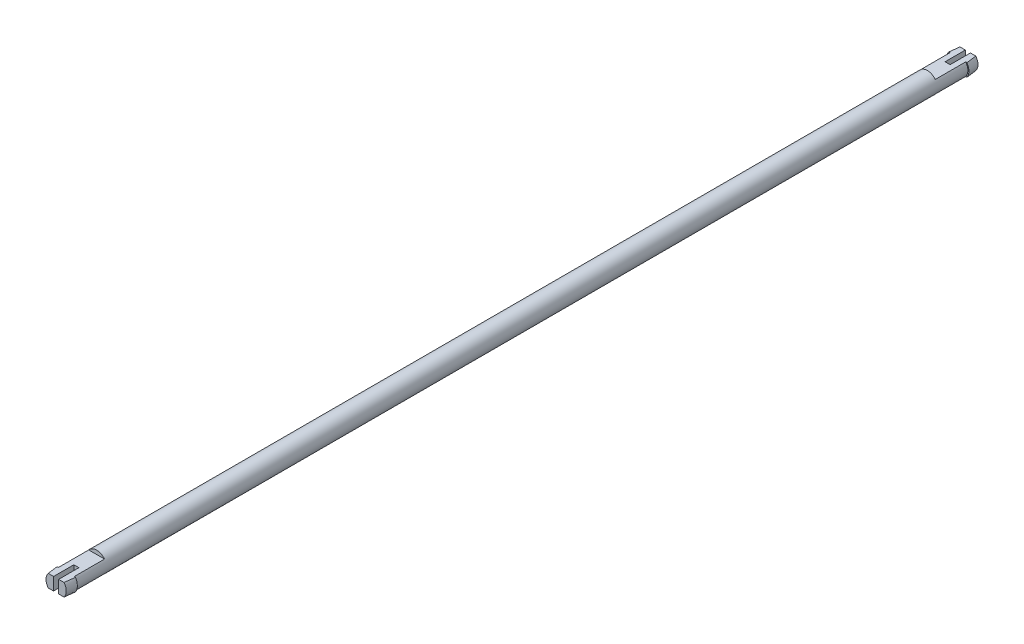
ISO-10303-21;
HEADER;
FILE_DESCRIPTION(('STEP AP214'),'2;1');
FILE_NAME('part.step','',(''),(''),'','','');
FILE_SCHEMA(('AUTOMOTIVE_DESIGN { 1 0 10303 214 1 1 1 1 }'));
ENDSEC;
DATA;
#1=APPLICATION_CONTEXT('core data for automotive mechanical design processes');
#2=APPLICATION_PROTOCOL_DEFINITION('international standard','automotive_design',2000,#1);
#3=PRODUCT_CONTEXT('',#1,'mechanical');
#4=PRODUCT('Part','Part','',(#3));
#5=PRODUCT_RELATED_PRODUCT_CATEGORY('part','',(#4));
#6=PRODUCT_DEFINITION_FORMATION('','',#4);
#7=PRODUCT_DEFINITION_CONTEXT('part definition',#1,'design');
#8=PRODUCT_DEFINITION('design','',#6,#7);
#9=PRODUCT_DEFINITION_SHAPE('','',#8);
#10=(LENGTH_UNIT() NAMED_UNIT(*) SI_UNIT(.MILLI.,.METRE.));
#11=(NAMED_UNIT(*) PLANE_ANGLE_UNIT() SI_UNIT($,.RADIAN.));
#12=(NAMED_UNIT(*) SI_UNIT($,.STERADIAN.) SOLID_ANGLE_UNIT());
#13=UNCERTAINTY_MEASURE_WITH_UNIT(LENGTH_MEASURE(1.E-05),#10,'distance_accuracy_value','');
#14=(GEOMETRIC_REPRESENTATION_CONTEXT(3) GLOBAL_UNCERTAINTY_ASSIGNED_CONTEXT((#13)) GLOBAL_UNIT_ASSIGNED_CONTEXT((#10,
#11,#12)) REPRESENTATION_CONTEXT('',''));
#15=CARTESIAN_POINT('',(0.,0.,0.));
#16=DIRECTION('',(0.,0.,1.));
#17=DIRECTION('',(1.,0.,0.));
#18=AXIS2_PLACEMENT_3D('',#15,#16,#17);
#19=CARTESIAN_POINT('',(0.,0.,-180.));
#20=DIRECTION('',(0.,0.,1.));
#21=DIRECTION('',(1.,0.,0.));
#22=AXIS2_PLACEMENT_3D('',#19,#20,#21);
#23=PLANE('',#22);
#24=DIRECTION('',(-1.,0.,0.));
#25=VECTOR('',#24,1.);
#26=CARTESIAN_POINT('',(0.,-1.25,-180.));
#27=LINE('',#26,#25);
#28=CARTESIAN_POINT('',(1.5612494995996,-1.25,-180.));
#29=VERTEX_POINT('',#28);
#30=CARTESIAN_POINT('',(0.49999999999999,-1.25,-180.));
#31=VERTEX_POINT('',#30);
#32=EDGE_CURVE('E215',#29,#31,#27,.T.);
#33=ORIENTED_EDGE('',*,*,#32,.T.);
#34=DIRECTION('',(0.,1.,0.));
#35=VECTOR('',#34,1.);
#36=CARTESIAN_POINT('',(0.49999999999999,-2.,-180.));
#37=LINE('',#36,#35);
#38=CARTESIAN_POINT('',(0.49999999999999,1.25,-180.));
#39=VERTEX_POINT('',#38);
#40=EDGE_CURVE('E201',#31,#39,#37,.T.);
#41=ORIENTED_EDGE('',*,*,#40,.T.);
#42=DIRECTION('',(1.,0.,0.));
#43=VECTOR('',#42,1.);
#44=CARTESIAN_POINT('',(0.,1.25,-180.));
#45=LINE('',#44,#43);
#46=CARTESIAN_POINT('',(1.5612494995996,1.25,-180.));
#47=VERTEX_POINT('',#46);
#48=EDGE_CURVE('E213',#39,#47,#45,.T.);
#49=ORIENTED_EDGE('',*,*,#48,.T.);
#50=CARTESIAN_POINT('',(0.,0.,-180.));
#51=DIRECTION('',(0.,0.,1.));
#52=DIRECTION('',(1.,0.,0.));
#53=AXIS2_PLACEMENT_3D('',#50,#51,#52);
#54=CIRCLE('',#53,2.);
#55=EDGE_CURVE('E410',#29,#47,#54,.T.);
#56=ORIENTED_EDGE('',*,*,#55,.F.);
#57=EDGE_LOOP('',(#33,#41,#49,#56));
#58=FACE_BOUND('',#57,.T.);
#59=ADVANCED_FACE('F36',(#58),#23,.F.);
#60=CARTESIAN_POINT('',(0.,0.,-178.));
#61=DIRECTION('',(0.,0.,1.));
#62=DIRECTION('',(1.,0.,0.));
#63=AXIS2_PLACEMENT_3D('',#60,#61,#62);
#64=PLANE('',#63);
#65=DIRECTION('',(-1.,0.,0.));
#66=VECTOR('',#65,1.);
#67=CARTESIAN_POINT('',(0.,-1.25,-178.));
#68=LINE('',#67,#66);
#69=CARTESIAN_POINT('',(1.81038669902326,-1.25,-178.));
#70=VERTEX_POINT('',#69);
#71=CARTESIAN_POINT('',(1.5612494995996,-1.25,-178.));
#72=VERTEX_POINT('',#71);
#73=EDGE_CURVE('E262',#70,#72,#68,.T.);
#74=ORIENTED_EDGE('',*,*,#73,.F.);
#75=CARTESIAN_POINT('',(0.,0.,-178.));
#76=DIRECTION('',(0.,0.,1.));
#77=DIRECTION('',(1.,0.,0.));
#78=AXIS2_PLACEMENT_3D('',#75,#76,#77);
#79=CIRCLE('',#78,2.2);
#80=CARTESIAN_POINT('',(1.81038669902326,1.25,-178.));
#81=VERTEX_POINT('',#80);
#82=EDGE_CURVE('E309',#70,#81,#79,.T.);
#83=ORIENTED_EDGE('',*,*,#82,.T.);
#84=DIRECTION('',(1.,0.,0.));
#85=VECTOR('',#84,1.);
#86=CARTESIAN_POINT('',(0.,1.25,-178.));
#87=LINE('',#86,#85);
#88=CARTESIAN_POINT('',(1.5612494995996,1.25,-178.));
#89=VERTEX_POINT('',#88);
#90=EDGE_CURVE('E293',#89,#81,#87,.T.);
#91=ORIENTED_EDGE('',*,*,#90,.F.);
#92=CARTESIAN_POINT('',(0.,0.,-178.));
#93=DIRECTION('',(0.,0.,1.));
#94=DIRECTION('',(1.,0.,0.));
#95=AXIS2_PLACEMENT_3D('',#92,#93,#94);
#96=CIRCLE('',#95,2.);
#97=EDGE_CURVE('E225',#89,#72,#96,.F.);
#98=ORIENTED_EDGE('',*,*,#97,.T.);
#99=EDGE_LOOP('',(#74,#83,#91,#98));
#100=FACE_BOUND('',#99,.T.);
#101=ADVANCED_FACE('F451',(#100),#64,.T.);
#102=CARTESIAN_POINT('',(0.,0.,-178.));
#103=DIRECTION('',(0.,0.,1.));
#104=DIRECTION('',(1.,0.,0.));
#105=AXIS2_PLACEMENT_3D('',#102,#103,#104);
#106=CONICAL_SURFACE('',#105,2.2,0.0996686524911558);
#107=CARTESIAN_POINT('',(-2.07154781563106,-1.25,-175.805351103093));
#108=CARTESIAN_POINT('',(-2.03550722726415,-1.25,-176.113918017925));
#109=CARTESIAN_POINT('',(-1.99922295149765,-1.25,-176.422456319055));
#110=CARTESIAN_POINT('',(-1.92607039278535,-1.25,-177.039464824649));
#111=CARTESIAN_POINT('',(-1.88920210764818,-1.25,-177.347935028854));
#112=CARTESIAN_POINT('',(-1.77758091435321,-1.25,-178.273188755434));
#113=CARTESIAN_POINT('',(-1.70180760472736,-1.25,-178.889850372761));
#114=CARTESIAN_POINT('',(-1.58512147260781,-1.25,-179.814476021835));
#115=CARTESIAN_POINT('',(-1.54572075887386,-1.25,-180.122630781761));
#116=CARTESIAN_POINT('',(-1.46564062998627,-1.25,-180.73877265943));
#117=CARTESIAN_POINT('',(-1.42496122188896,-1.25,-181.046759778088));
#118=CARTESIAN_POINT('',(-1.34198072748196,-1.25,-181.662533940232));
#119=CARTESIAN_POINT('',(-1.29967955336679,-1.25,-181.970320971964));
#120=CARTESIAN_POINT('',(-1.212856352482,-1.25,-182.585586883458));
#121=CARTESIAN_POINT('',(-1.16833428338414,-1.25,-182.893065757234));
#122=CARTESIAN_POINT('',(-1.12240193199719,-1.25,-183.20033900059));
#123=B_SPLINE_CURVE_WITH_KNOTS('',3,(#107,#108,#109,#110,#111,#112,#113,#114,#115,#116,#117,
#118,#119,#120,#121,#122),.UNSPECIFIED.,.F.,.F.,(4,2,2,2,2,2,2,4),(0.,0.931993165762316,
1.86398982945298,3.72787750877086,4.65986577266916,5.59184889439998,6.52388254692394,
7.45593396996284),.UNSPECIFIED.);
#124=CARTESIAN_POINT('',(-1.81038669902328,-1.25,-178.));
#125=VERTEX_POINT('',#124);
#126=CARTESIAN_POINT('',(-1.5612494995996,-1.25,-180.));
#127=VERTEX_POINT('',#126);
#128=EDGE_CURVE('E277',#125,#127,#123,.T.);
#129=ORIENTED_EDGE('',*,*,#128,.F.);
#130=CARTESIAN_POINT('',(-1.81038669902328,1.25,-178.));
#131=VERTEX_POINT('',#130);
#132=EDGE_CURVE('E310',#131,#125,#79,.T.);
#133=ORIENTED_EDGE('',*,*,#132,.F.);
#134=CARTESIAN_POINT('',(-1.12240193199719,1.25,-183.20033900059));
#135=CARTESIAN_POINT('',(-1.16007318188197,1.25,-182.948455021263));
#136=CARTESIAN_POINT('',(-1.19677568222073,1.25,-182.696428856193));
#137=CARTESIAN_POINT('',(-1.26860770564262,1.25,-182.19215526578));
#138=CARTESIAN_POINT('',(-1.30373724824447,1.25,-181.939907843221));
#139=CARTESIAN_POINT('',(-1.37278762127908,1.25,-181.435257171819));
#140=CARTESIAN_POINT('',(-1.40670849276508,1.25,-181.182853928564));
#141=CARTESIAN_POINT('',(-1.4735706322551,1.25,-180.677917139504));
#142=CARTESIAN_POINT('',(-1.50651189747345,1.25,-180.42538359333));
#143=CARTESIAN_POINT('',(-1.56766910496904,1.25,-179.950655935062));
#144=CARTESIAN_POINT('',(-1.59597605442954,1.25,-179.728473520007));
#145=CARTESIAN_POINT('',(-1.66291250795866,1.25,-179.198043320873));
#146=CARTESIAN_POINT('',(-1.70129728585271,1.25,-178.889764657388));
#147=CARTESIAN_POINT('',(-1.77723656698479,1.25,-178.273104527754));
#148=CARTESIAN_POINT('',(-1.81479106820386,1.25,-177.964723061356));
#149=CARTESIAN_POINT('',(-1.88921121609688,1.25,-177.347881711202));
#150=CARTESIAN_POINT('',(-1.92607687286846,1.25,-177.039421828663));
#151=CARTESIAN_POINT('',(-1.99922418459549,1.25,-176.422434258166));
#152=CARTESIAN_POINT('',(-2.03550584228451,1.25,-176.113906570532));
#153=CARTESIAN_POINT('',(-2.07154781563106,1.25,-175.805351103093));
#154=B_SPLINE_CURVE_WITH_KNOTS('',3,(#134,#135,#136,#137,#138,#139,#140,#141,#142,#143,#144,
#145,#146,#147,#148,#149,#150,#151,#152,#153),.UNSPECIFIED.,.F.,.F.,(4,2,2,2,2,2,2,2,2,4),(0.,
0.764050536151581,1.52809158862139,2.2921066651918,3.05612391415675,3.72805834866281,
4.66003438385211,5.59201268506319,6.52397731386903,7.45593757911214),.UNSPECIFIED.);
#155=CARTESIAN_POINT('',(-1.5612494995996,1.25,-180.));
#156=VERTEX_POINT('',#155);
#157=EDGE_CURVE('E300',#156,#131,#154,.T.);
#158=ORIENTED_EDGE('',*,*,#157,.F.);
#159=EDGE_CURVE('E411',#156,#127,#54,.T.);
#160=ORIENTED_EDGE('',*,*,#159,.T.);
#161=EDGE_LOOP('',(#129,#133,#158,#160));
#162=FACE_BOUND('',#161,.T.);
#163=ADVANCED_FACE('F457',(#162),#106,.T.);
#164=CARTESIAN_POINT('',(0.,0.,0.));
#165=DIRECTION('',(0.,0.,1.));
#166=DIRECTION('',(1.,0.,0.));
#167=AXIS2_PLACEMENT_3D('',#164,#165,#166);
#168=PLANE('',#167);
#169=DIRECTION('',(0.,-1.,0.));
#170=VECTOR('',#169,1.);
#171=CARTESIAN_POINT('',(-0.5,2.001,-1.11022302462516E-13));
#172=LINE('',#171,#170);
#173=CARTESIAN_POINT('',(-0.5,1.25,-1.11022302462516E-13));
#174=VERTEX_POINT('',#173);
#175=CARTESIAN_POINT('',(-0.5,-1.25,-1.11022302462516E-13));
#176=VERTEX_POINT('',#175);
#177=EDGE_CURVE('E326',#174,#176,#172,.T.);
#178=ORIENTED_EDGE('',*,*,#177,.F.);
#179=DIRECTION('',(1.,0.,0.));
#180=VECTOR('',#179,1.);
#181=CARTESIAN_POINT('',(0.,1.25,0.));
#182=LINE('',#181,#180);
#183=CARTESIAN_POINT('',(-1.5612494995996,1.25,-1.11022302462516E-13));
#184=VERTEX_POINT('',#183);
#185=EDGE_CURVE('E425',#184,#174,#182,.T.);
#186=ORIENTED_EDGE('',*,*,#185,.F.);
#187=CARTESIAN_POINT('',(0.,0.,-1.11022302462516E-13));
#188=DIRECTION('',(0.,0.,1.));
#189=DIRECTION('',(1.,0.,0.));
#190=AXIS2_PLACEMENT_3D('',#187,#188,#189);
#191=CIRCLE('',#190,2.);
#192=CARTESIAN_POINT('',(-1.5612494995996,-1.25,0.));
#193=VERTEX_POINT('',#192);
#194=EDGE_CURVE('E406',#184,#193,#191,.T.);
#195=ORIENTED_EDGE('',*,*,#194,.T.);
#196=DIRECTION('',(-1.,0.,0.));
#197=VECTOR('',#196,1.);
#198=CARTESIAN_POINT('',(0.,-1.25,0.));
#199=LINE('',#198,#197);
#200=EDGE_CURVE('E418',#176,#193,#199,.T.);
#201=ORIENTED_EDGE('',*,*,#200,.F.);
#202=EDGE_LOOP('',(#178,#186,#195,#201));
#203=FACE_BOUND('',#202,.T.);
#204=ADVANCED_FACE('F481',(#203),#168,.T.);
#205=CARTESIAN_POINT('',(0.,0.,-1.11022302462516E-13));
#206=DIRECTION('',(0.,0.,-1.));
#207=DIRECTION('',(-1.,0.,0.));
#208=AXIS2_PLACEMENT_3D('',#205,#206,#207);
#209=CONICAL_SURFACE('',#208,2.,0.0996686524911667);
#210=CARTESIAN_POINT('',(-2.20629085167546,1.25,-5.35787712366069));
#211=CARTESIAN_POINT('',(-2.16911364127438,1.25,-5.03442418142204));
#212=CARTESIAN_POINT('',(-2.1317145198995,1.25,-4.71099685663597));
#213=CARTESIAN_POINT('',(-2.05638780976398,1.25,-4.0642029095394));
#214=CARTESIAN_POINT('',(-2.01846021960566,1.25,-3.74083628739172));
#215=CARTESIAN_POINT('',(-1.9037610902439,1.25,-2.77086975377678));
#216=CARTESIAN_POINT('',(-1.82607027221003,1.25,-2.12437765306018));
#217=CARTESIAN_POINT('',(-1.70685435031513,1.25,-1.15495865945319));
#218=CARTESIAN_POINT('',(-1.6666684414073,1.25,-0.831867113806467));
#219=CARTESIAN_POINT('',(-1.58517894557184,1.25,-0.185825927060391));
#220=CARTESIAN_POINT('',(-1.54387536251855,1.25,0.137123714526922));
#221=CARTESIAN_POINT('',(-1.45986916908056,1.25,0.782854266011989));
#222=CARTESIAN_POINT('',(-1.41716650618305,1.25,1.10563516911331));
#223=CARTESIAN_POINT('',(-1.32989270639119,1.25,1.75094775860939));
#224=CARTESIAN_POINT('',(-1.28532154707353,1.25,2.07347944196599));
#225=CARTESIAN_POINT('',(-1.23958118370648,1.25,2.39584846975229));
#226=B_SPLINE_CURVE_WITH_KNOTS('',3,(#210,#211,#212,#213,#214,#215,#216,#217,#218,#219,#220,
#221,#222,#223,#224,#225),.UNSPECIFIED.,.F.,.F.,(4,2,2,2,2,2,2,4),(0.,0.976747065340098,
1.95349671443935,3.90691894725972,4.88366075798533,5.86039918335274,6.83717431153941,
7.81396116508769),.UNSPECIFIED.);
#227=CARTESIAN_POINT('',(-1.81038669902317,1.25,-2.));
#228=VERTEX_POINT('',#227);
#229=EDGE_CURVE('E342',#228,#184,#226,.T.);
#230=ORIENTED_EDGE('',*,*,#229,.F.);
#231=CARTESIAN_POINT('',(0.,0.,-2.));
#232=DIRECTION('',(0.,0.,1.));
#233=DIRECTION('',(1.,0.,0.));
#234=AXIS2_PLACEMENT_3D('',#231,#232,#233);
#235=CIRCLE('',#234,2.2);
#236=CARTESIAN_POINT('',(-1.81038669902317,-1.25,-2.));
#237=VERTEX_POINT('',#236);
#238=EDGE_CURVE('E402',#228,#237,#235,.T.);
#239=ORIENTED_EDGE('',*,*,#238,.T.);
#240=CARTESIAN_POINT('',(-1.23958118370648,-1.25,2.39584846975229));
#241=CARTESIAN_POINT('',(-1.27708445163933,-1.25,2.13162650097855));
#242=CARTESIAN_POINT('',(-1.31378723609277,-1.25,1.86729257599777));
#243=CARTESIAN_POINT('',(-1.38587498011763,-1.25,1.338446908863));
#244=CARTESIAN_POINT('',(-1.42125994975574,-1.25,1.07393516808305));
#245=CARTESIAN_POINT('',(-1.49099498681416,-1.25,0.544781873474827));
#246=CARTESIAN_POINT('',(-1.52534507748139,-1.25,0.280140322698446));
#247=CARTESIAN_POINT('',(-1.59319606726224,-1.25,-0.249251984131474));
#248=CARTESIAN_POINT('',(-1.62669696491897,-1.25,-0.514002740371575));
#249=CARTESIAN_POINT('',(-1.68902097967954,-1.25,-1.01186777884924));
#250=CARTESIAN_POINT('',(-1.71792365975446,-1.25,-1.2449721226868));
#251=CARTESIAN_POINT('',(-1.82607281461731,-1.25,-2.12439276505841));
#252=CARTESIAN_POINT('',(-1.90376491575885,-1.25,-2.77090043818359));
#253=CARTESIAN_POINT('',(-2.01846468029958,-1.25,-3.74087483946421));
#254=CARTESIAN_POINT('',(-2.05639139314502,-1.25,-4.06423386196729));
#255=CARTESIAN_POINT('',(-2.13171635303438,-1.25,-4.71101241305847));
#256=CARTESIAN_POINT('',(-2.16911460179217,-1.25,-5.03443194144689));
#257=CARTESIAN_POINT('',(-2.20629085167546,-1.25,-5.35787712366069));
#258=B_SPLINE_CURVE_WITH_KNOTS('',3,(#240,#241,#242,#243,#244,#245,#246,#247,#248,#249,#250,
#251,#252,#253,#254,#255,#256,#257),.UNSPECIFIED.,.F.,.F.,(4,2,2,2,2,2,2,2,4),(0.,
0.800607232202036,1.60120834737586,2.40179146488673,3.20237595579525,3.9070435129518,
5.86051217913118,6.83723890380331,7.8139624601189),.UNSPECIFIED.);
#259=EDGE_CURVE('E394',#193,#237,#258,.T.);
#260=ORIENTED_EDGE('',*,*,#259,.F.);
#261=ORIENTED_EDGE('',*,*,#194,.F.);
#262=EDGE_LOOP('',(#230,#239,#260,#261));
#263=FACE_BOUND('',#262,.T.);
#264=ADVANCED_FACE('F485',(#263),#209,.T.);
#265=CARTESIAN_POINT('',(0.,0.,-2.));
#266=DIRECTION('',(0.,0.,-1.));
#267=DIRECTION('',(-1.,0.,0.));
#268=AXIS2_PLACEMENT_3D('',#265,#266,#267);
#269=PLANE('',#268);
#270=DIRECTION('',(-1.,0.,0.));
#271=VECTOR('',#270,1.);
#272=CARTESIAN_POINT('',(0.,1.25,-2.));
#273=LINE('',#272,#271);
#274=CARTESIAN_POINT('',(1.81038669902317,1.25,-2.));
#275=VERTEX_POINT('',#274);
#276=CARTESIAN_POINT('',(1.5612494995996,1.25,-2.));
#277=VERTEX_POINT('',#276);
#278=EDGE_CURVE('E343',#275,#277,#273,.T.);
#279=ORIENTED_EDGE('',*,*,#278,.F.);
#280=CARTESIAN_POINT('',(1.81038669902317,-1.25,-2.));
#281=VERTEX_POINT('',#280);
#282=EDGE_CURVE('E403',#281,#275,#235,.T.);
#283=ORIENTED_EDGE('',*,*,#282,.F.);
#284=DIRECTION('',(1.,0.,0.));
#285=VECTOR('',#284,1.);
#286=CARTESIAN_POINT('',(0.,-1.25,-2.));
#287=LINE('',#286,#285);
#288=CARTESIAN_POINT('',(1.5612494995996,-1.25,-2.));
#289=VERTEX_POINT('',#288);
#290=EDGE_CURVE('E377',#289,#281,#287,.T.);
#291=ORIENTED_EDGE('',*,*,#290,.F.);
#292=CARTESIAN_POINT('',(0.,0.,-2.));
#293=DIRECTION('',(0.,0.,-1.));
#294=DIRECTION('',(-1.,0.,0.));
#295=AXIS2_PLACEMENT_3D('',#292,#293,#294);
#296=CIRCLE('',#295,2.);
#297=EDGE_CURVE('E415',#289,#277,#296,.F.);
#298=ORIENTED_EDGE('',*,*,#297,.T.);
#299=EDGE_LOOP('',(#279,#283,#291,#298));
#300=FACE_BOUND('',#299,.T.);
#301=ADVANCED_FACE('F490',(#300),#269,.T.);
#302=CARTESIAN_POINT('',(0.,0.,-180.));
#303=DIRECTION('',(0.,0.,1.));
#304=DIRECTION('',(1.,0.,0.));
#305=AXIS2_PLACEMENT_3D('',#302,#303,#304);
#306=CYLINDRICAL_SURFACE('',#305,2.);
#307=DIRECTION('',(0.,0.,1.));
#308=VECTOR('',#307,1.);
#309=CARTESIAN_POINT('',(-1.5612494995996,-1.25,-180.));
#310=LINE('',#309,#308);
#311=CARTESIAN_POINT('',(-1.5612494995996,-1.25,-172.));
#312=VERTEX_POINT('',#311);
#313=CARTESIAN_POINT('',(-1.5612494995996,-1.25,-178.));
#314=VERTEX_POINT('',#313);
#315=EDGE_CURVE('E284',#312,#314,#310,.F.);
#316=ORIENTED_EDGE('',*,*,#315,.F.);
#317=CARTESIAN_POINT('',(0.,0.,-172.));
#318=DIRECTION('',(0.,0.,-1.));
#319=DIRECTION('',(-1.,0.,0.));
#320=AXIS2_PLACEMENT_3D('',#317,#318,#319);
#321=CIRCLE('',#320,2.);
#322=CARTESIAN_POINT('',(1.5612494995996,-1.25,-172.));
#323=VERTEX_POINT('',#322);
#324=EDGE_CURVE('E236',#312,#323,#321,.F.);
#325=ORIENTED_EDGE('',*,*,#324,.T.);
#326=DIRECTION('',(0.,0.,1.));
#327=VECTOR('',#326,1.);
#328=CARTESIAN_POINT('',(1.5612494995996,-1.25,-180.));
#329=LINE('',#328,#327);
#330=EDGE_CURVE('E283',#72,#323,#329,.T.);
#331=ORIENTED_EDGE('',*,*,#330,.F.);
#332=ORIENTED_EDGE('',*,*,#97,.F.);
#333=DIRECTION('',(0.,0.,1.));
#334=VECTOR('',#333,1.);
#335=CARTESIAN_POINT('',(1.5612494995996,1.25,-180.));
#336=LINE('',#335,#334);
#337=CARTESIAN_POINT('',(1.5612494995996,1.25,-172.));
#338=VERTEX_POINT('',#337);
#339=EDGE_CURVE('E306',#338,#89,#336,.F.);
#340=ORIENTED_EDGE('',*,*,#339,.F.);
#341=CARTESIAN_POINT('',(0.,0.,-172.));
#342=DIRECTION('',(0.,0.,1.));
#343=DIRECTION('',(1.,0.,0.));
#344=AXIS2_PLACEMENT_3D('',#341,#342,#343);
#345=CIRCLE('',#344,2.);
#346=CARTESIAN_POINT('',(-1.5612494995996,1.25,-172.));
#347=VERTEX_POINT('',#346);
#348=EDGE_CURVE('E228',#347,#338,#345,.F.);
#349=ORIENTED_EDGE('',*,*,#348,.F.);
#350=DIRECTION('',(0.,0.,1.));
#351=VECTOR('',#350,1.);
#352=CARTESIAN_POINT('',(-1.5612494995996,1.25,-180.));
#353=LINE('',#352,#351);
#354=CARTESIAN_POINT('',(-1.5612494995996,1.25,-178.));
#355=VERTEX_POINT('',#354);
#356=EDGE_CURVE('E307',#355,#347,#353,.T.);
#357=ORIENTED_EDGE('',*,*,#356,.F.);
#358=EDGE_CURVE('E230',#314,#355,#96,.F.);
#359=ORIENTED_EDGE('',*,*,#358,.F.);
#360=EDGE_LOOP('',(#316,#325,#331,#332,#340,#349,#357,#359));
#361=FACE_BOUND('',#360,.T.);
#362=DIRECTION('',(0.,0.,1.));
#363=VECTOR('',#362,1.);
#364=CARTESIAN_POINT('',(1.5612494995996,1.25,-180.));
#365=LINE('',#364,#363);
#366=CARTESIAN_POINT('',(1.5612494995996,1.25,-8.00000000000001));
#367=VERTEX_POINT('',#366);
#368=EDGE_CURVE('E372',#277,#367,#365,.F.);
#369=ORIENTED_EDGE('',*,*,#368,.F.);
#370=ORIENTED_EDGE('',*,*,#297,.F.);
#371=DIRECTION('',(0.,0.,1.));
#372=VECTOR('',#371,1.);
#373=CARTESIAN_POINT('',(1.5612494995996,-1.25,-180.));
#374=LINE('',#373,#372);
#375=CARTESIAN_POINT('',(1.5612494995996,-1.25,-8.00000000000001));
#376=VERTEX_POINT('',#375);
#377=EDGE_CURVE('E385',#376,#289,#374,.T.);
#378=ORIENTED_EDGE('',*,*,#377,.F.);
#379=CARTESIAN_POINT('',(0.,0.,-8.00000000000001));
#380=DIRECTION('',(0.,0.,-1.));
#381=DIRECTION('',(-1.,0.,0.));
#382=AXIS2_PLACEMENT_3D('',#379,#380,#381);
#383=CIRCLE('',#382,2.);
#384=CARTESIAN_POINT('',(-1.5612494995996,-1.25,-8.00000000000001));
#385=VERTEX_POINT('',#384);
#386=EDGE_CURVE('E422',#385,#376,#383,.F.);
#387=ORIENTED_EDGE('',*,*,#386,.F.);
#388=DIRECTION('',(0.,0.,1.));
#389=VECTOR('',#388,1.);
#390=CARTESIAN_POINT('',(-1.5612494995996,-1.25,-180.));
#391=LINE('',#390,#389);
#392=CARTESIAN_POINT('',(-1.5612494995996,-1.25,-2.));
#393=VERTEX_POINT('',#392);
#394=EDGE_CURVE('E400',#393,#385,#391,.F.);
#395=ORIENTED_EDGE('',*,*,#394,.F.);
#396=CARTESIAN_POINT('',(-1.5612494995996,1.25,-2.));
#397=VERTEX_POINT('',#396);
#398=EDGE_CURVE('E414',#397,#393,#296,.F.);
#399=ORIENTED_EDGE('',*,*,#398,.F.);
#400=DIRECTION('',(0.,0.,1.));
#401=VECTOR('',#400,1.);
#402=CARTESIAN_POINT('',(-1.5612494995996,1.25,-180.));
#403=LINE('',#402,#401);
#404=CARTESIAN_POINT('',(-1.5612494995996,1.25,-8.00000000000001));
#405=VERTEX_POINT('',#404);
#406=EDGE_CURVE('E350',#405,#397,#403,.T.);
#407=ORIENTED_EDGE('',*,*,#406,.F.);
#408=CARTESIAN_POINT('',(0.,0.,-8.00000000000001));
#409=DIRECTION('',(0.,0.,-1.));
#410=DIRECTION('',(-1.,0.,0.));
#411=AXIS2_PLACEMENT_3D('',#408,#409,#410);
#412=CIRCLE('',#411,2.);
#413=EDGE_CURVE('E427',#367,#405,#412,.F.);
#414=ORIENTED_EDGE('',*,*,#413,.F.);
#415=EDGE_LOOP('',(#369,#370,#378,#387,#395,#399,#407,#414));
#416=FACE_BOUND('',#415,.T.);
#417=ADVANCED_FACE('F38',(#361,#416),#306,.T.);
#418=CARTESIAN_POINT('',(1.23958118370648,1.25,2.39584846975229));
#419=CARTESIAN_POINT('',(1.27708445163933,1.25,2.13162650097855));
#420=CARTESIAN_POINT('',(1.31378723609277,1.25,1.86729257599777));
#421=CARTESIAN_POINT('',(1.38587498011763,1.25,1.338446908863));
#422=CARTESIAN_POINT('',(1.42125994975574,1.25,1.07393516808305));
#423=CARTESIAN_POINT('',(1.49099498681416,1.25,0.544781873474827));
#424=CARTESIAN_POINT('',(1.52534507748139,1.25,0.280140322698446));
#425=CARTESIAN_POINT('',(1.59319606726224,1.25,-0.249251984131474));
#426=CARTESIAN_POINT('',(1.62669696491897,1.25,-0.514002740371575));
#427=CARTESIAN_POINT('',(1.68902097967954,1.25,-1.01186777884924));
#428=CARTESIAN_POINT('',(1.71792365975446,1.25,-1.2449721226868));
#429=CARTESIAN_POINT('',(1.82607281461731,1.25,-2.12439276505841));
#430=CARTESIAN_POINT('',(1.90376491575885,1.25,-2.77090043818359));
#431=CARTESIAN_POINT('',(2.01846468029958,1.25,-3.74087483946421));
#432=CARTESIAN_POINT('',(2.05639139314502,1.25,-4.06423386196729));
#433=CARTESIAN_POINT('',(2.13171635303438,1.25,-4.71101241305847));
#434=CARTESIAN_POINT('',(2.16911460179217,1.25,-5.03443194144689));
#435=CARTESIAN_POINT('',(2.20629085167546,1.25,-5.35787712366069));
#436=B_SPLINE_CURVE_WITH_KNOTS('',3,(#418,#419,#420,#421,#422,#423,#424,#425,#426,#427,#428,
#429,#430,#431,#432,#433,#434,#435),.UNSPECIFIED.,.F.,.F.,(4,2,2,2,2,2,2,2,4),(0.,
0.800607232202036,1.60120834737586,2.40179146488673,3.20237595579525,3.9070435129518,
5.86051217913118,6.83723890380331,7.8139624601189),.UNSPECIFIED.);
#437=CARTESIAN_POINT('',(1.5612494995996,1.25,0.));
#438=VERTEX_POINT('',#437);
#439=EDGE_CURVE('E367',#438,#275,#436,.T.);
#440=ORIENTED_EDGE('',*,*,#439,.F.);
#441=CARTESIAN_POINT('',(1.5612494995996,-1.25,-1.11022302462516E-13));
#442=VERTEX_POINT('',#441);
#443=EDGE_CURVE('E407',#442,#438,#191,.T.);
#444=ORIENTED_EDGE('',*,*,#443,.F.);
#445=CARTESIAN_POINT('',(2.20629085167546,-1.25,-5.35787712366069));
#446=CARTESIAN_POINT('',(2.16911364127438,-1.25,-5.03442418142204));
#447=CARTESIAN_POINT('',(2.1317145198995,-1.25,-4.71099685663597));
#448=CARTESIAN_POINT('',(2.05638780976398,-1.25,-4.0642029095394));
#449=CARTESIAN_POINT('',(2.01846021960566,-1.25,-3.74083628739172));
#450=CARTESIAN_POINT('',(1.9037610902439,-1.25,-2.77086975377678));
#451=CARTESIAN_POINT('',(1.82607027221003,-1.25,-2.12437765306018));
#452=CARTESIAN_POINT('',(1.70685435031513,-1.25,-1.15495865945319));
#453=CARTESIAN_POINT('',(1.6666684414073,-1.25,-0.831867113806467));
#454=CARTESIAN_POINT('',(1.58517894557184,-1.25,-0.185825927060391));
#455=CARTESIAN_POINT('',(1.54387536251855,-1.25,0.137123714526922));
#456=CARTESIAN_POINT('',(1.45986916908056,-1.25,0.782854266011989));
#457=CARTESIAN_POINT('',(1.41716650618305,-1.25,1.10563516911331));
#458=CARTESIAN_POINT('',(1.32989270639119,-1.25,1.75094775860939));
#459=CARTESIAN_POINT('',(1.28532154707353,-1.25,2.07347944196599));
#460=CARTESIAN_POINT('',(1.23958118370648,-1.25,2.39584846975229));
#461=B_SPLINE_CURVE_WITH_KNOTS('',3,(#445,#446,#447,#448,#449,#450,#451,#452,#453,#454,#455,
#456,#457,#458,#459,#460),.UNSPECIFIED.,.F.,.F.,(4,2,2,2,2,2,2,4),(0.,0.976747065340098,
1.95349671443935,3.90691894725972,4.88366075798533,5.86039918335274,6.83717431153941,
7.81396116508769),.UNSPECIFIED.);
#462=EDGE_CURVE('E379',#281,#442,#461,.T.);
#463=ORIENTED_EDGE('',*,*,#462,.F.);
#464=ORIENTED_EDGE('',*,*,#282,.T.);
#465=EDGE_LOOP('',(#440,#444,#463,#464));
#466=FACE_BOUND('',#465,.T.);
#467=ADVANCED_FACE('F352',(#466),#209,.T.);
#468=EDGE_CURVE('E340',#397,#228,#273,.T.);
#469=ORIENTED_EDGE('',*,*,#468,.F.);
#470=ORIENTED_EDGE('',*,*,#398,.T.);
#471=EDGE_CURVE('E380',#237,#393,#287,.T.);
#472=ORIENTED_EDGE('',*,*,#471,.F.);
#473=ORIENTED_EDGE('',*,*,#238,.F.);
#474=EDGE_LOOP('',(#469,#470,#472,#473));
#475=FACE_BOUND('',#474,.T.);
#476=ADVANCED_FACE('F392',(#475),#269,.T.);
#477=DIRECTION('',(0.,-1.,0.));
#478=VECTOR('',#477,1.);
#479=CARTESIAN_POINT('',(0.5,2.001,-1.11022302462516E-13));
#480=LINE('',#479,#478);
#481=CARTESIAN_POINT('',(0.5,1.25,-1.11022302462516E-13));
#482=VERTEX_POINT('',#481);
#483=CARTESIAN_POINT('',(0.5,-1.25,-1.11022302462516E-13));
#484=VERTEX_POINT('',#483);
#485=EDGE_CURVE('E329',#482,#484,#480,.T.);
#486=ORIENTED_EDGE('',*,*,#485,.T.);
#487=EDGE_CURVE('E419',#442,#484,#199,.T.);
#488=ORIENTED_EDGE('',*,*,#487,.F.);
#489=ORIENTED_EDGE('',*,*,#443,.T.);
#490=EDGE_CURVE('E424',#482,#438,#182,.T.);
#491=ORIENTED_EDGE('',*,*,#490,.F.);
#492=EDGE_LOOP('',(#486,#488,#489,#491));
#493=FACE_BOUND('',#492,.T.);
#494=ADVANCED_FACE('F390',(#493),#168,.T.);
#495=CARTESIAN_POINT('',(-2.1,-1.25,-8.));
#496=DIRECTION('',(0.,1.,0.));
#497=DIRECTION('',(0.,0.,1.));
#498=AXIS2_PLACEMENT_3D('',#495,#496,#497);
#499=PLANE('',#498);
#500=DIRECTION('',(1.,0.,0.));
#501=VECTOR('',#500,1.);
#502=CARTESIAN_POINT('',(-0.499999999999999,-1.25,-4.00000000000011));
#503=LINE('',#502,#501);
#504=CARTESIAN_POINT('',(-0.499999999999999,-1.25,-4.00000000000011));
#505=VERTEX_POINT('',#504);
#506=CARTESIAN_POINT('',(0.5,-1.25,-4.00000000000011));
#507=VERTEX_POINT('',#506);
#508=EDGE_CURVE('E320',#505,#507,#503,.T.);
#509=ORIENTED_EDGE('',*,*,#508,.F.);
#510=DIRECTION('',(0.,0.,-1.));
#511=VECTOR('',#510,1.);
#512=CARTESIAN_POINT('',(-0.5,-1.25,-1.11022302462516E-13));
#513=LINE('',#512,#511);
#514=EDGE_CURVE('E317',#176,#505,#513,.T.);
#515=ORIENTED_EDGE('',*,*,#514,.F.);
#516=ORIENTED_EDGE('',*,*,#200,.T.);
#517=ORIENTED_EDGE('',*,*,#259,.T.);
#518=ORIENTED_EDGE('',*,*,#471,.T.);
#519=ORIENTED_EDGE('',*,*,#394,.T.);
#520=DIRECTION('',(-1.,0.,0.));
#521=VECTOR('',#520,1.);
#522=CARTESIAN_POINT('',(-2.1,-1.25,-8.));
#523=LINE('',#522,#521);
#524=EDGE_CURVE('E374',#376,#385,#523,.T.);
#525=ORIENTED_EDGE('',*,*,#524,.F.);
#526=ORIENTED_EDGE('',*,*,#377,.T.);
#527=ORIENTED_EDGE('',*,*,#290,.T.);
#528=ORIENTED_EDGE('',*,*,#462,.T.);
#529=ORIENTED_EDGE('',*,*,#487,.T.);
#530=DIRECTION('',(0.,0.,1.));
#531=VECTOR('',#530,1.);
#532=CARTESIAN_POINT('',(0.5,-1.25,-1.11022302462516E-13));
#533=LINE('',#532,#531);
#534=EDGE_CURVE('E323',#507,#484,#533,.T.);
#535=ORIENTED_EDGE('',*,*,#534,.F.);
#536=EDGE_LOOP('',(#509,#515,#516,#517,#518,#519,#525,#526,#527,#528,#529,#535));
#537=FACE_BOUND('',#536,.T.);
#538=ADVANCED_FACE('F387',(#537),#499,.F.);
#539=CARTESIAN_POINT('',(-2.1,-1.25,-8.));
#540=DIRECTION('',(0.,0.,-1.));
#541=DIRECTION('',(-1.,0.,0.));
#542=AXIS2_PLACEMENT_3D('',#539,#540,#541);
#543=PLANE('',#542);
#544=ORIENTED_EDGE('',*,*,#386,.T.);
#545=ORIENTED_EDGE('',*,*,#524,.T.);
#546=EDGE_LOOP('',(#544,#545));
#547=FACE_BOUND('',#546,.T.);
#548=ADVANCED_FACE('F362',(#547),#543,.F.);
#549=CARTESIAN_POINT('',(-2.1,1.25,-8.));
#550=DIRECTION('',(0.,-1.,0.));
#551=DIRECTION('',(0.,0.,-1.));
#552=AXIS2_PLACEMENT_3D('',#549,#550,#551);
#553=PLANE('',#552);
#554=ORIENTED_EDGE('',*,*,#185,.T.);
#555=DIRECTION('',(0.,0.,1.));
#556=VECTOR('',#555,1.);
#557=CARTESIAN_POINT('',(-0.5,1.25,-1.11022302462516E-13));
#558=LINE('',#557,#556);
#559=CARTESIAN_POINT('',(-0.499999999999999,1.25,-4.00000000000011));
#560=VERTEX_POINT('',#559);
#561=EDGE_CURVE('E315',#560,#174,#558,.T.);
#562=ORIENTED_EDGE('',*,*,#561,.F.);
#563=DIRECTION('',(-1.,0.,0.));
#564=VECTOR('',#563,1.);
#565=CARTESIAN_POINT('',(-0.499999999999999,1.25,-4.00000000000011));
#566=LINE('',#565,#564);
#567=CARTESIAN_POINT('',(0.5,1.25,-4.00000000000011));
#568=VERTEX_POINT('',#567);
#569=EDGE_CURVE('E328',#568,#560,#566,.T.);
#570=ORIENTED_EDGE('',*,*,#569,.F.);
#571=DIRECTION('',(0.,0.,-1.));
#572=VECTOR('',#571,1.);
#573=CARTESIAN_POINT('',(0.5,1.25,-1.11022302462516E-13));
#574=LINE('',#573,#572);
#575=EDGE_CURVE('E313',#482,#568,#574,.T.);
#576=ORIENTED_EDGE('',*,*,#575,.F.);
#577=ORIENTED_EDGE('',*,*,#490,.T.);
#578=ORIENTED_EDGE('',*,*,#439,.T.);
#579=ORIENTED_EDGE('',*,*,#278,.T.);
#580=ORIENTED_EDGE('',*,*,#368,.T.);
#581=DIRECTION('',(1.,0.,0.));
#582=VECTOR('',#581,1.);
#583=CARTESIAN_POINT('',(-2.1,1.25,-8.));
#584=LINE('',#583,#582);
#585=EDGE_CURVE('E337',#405,#367,#584,.T.);
#586=ORIENTED_EDGE('',*,*,#585,.F.);
#587=ORIENTED_EDGE('',*,*,#406,.T.);
#588=ORIENTED_EDGE('',*,*,#468,.T.);
#589=ORIENTED_EDGE('',*,*,#229,.T.);
#590=EDGE_LOOP('',(#554,#562,#570,#576,#577,#578,#579,#580,#586,#587,#588,#589));
#591=FACE_BOUND('',#590,.T.);
#592=ADVANCED_FACE('F356',(#591),#553,.F.);
#593=CARTESIAN_POINT('',(2.1,2.25,-8.));
#594=DIRECTION('',(0.,0.,-1.));
#595=DIRECTION('',(-1.,0.,0.));
#596=AXIS2_PLACEMENT_3D('',#593,#594,#595);
#597=PLANE('',#596);
#598=ORIENTED_EDGE('',*,*,#413,.T.);
#599=ORIENTED_EDGE('',*,*,#585,.T.);
#600=EDGE_LOOP('',(#598,#599));
#601=FACE_BOUND('',#600,.T.);
#602=ADVANCED_FACE('F361',(#601),#597,.F.);
#603=CARTESIAN_POINT('',(-0.5,2.001,-1.11022302462516E-13));
#604=DIRECTION('',(-1.,0.,0.));
#605=DIRECTION('',(0.,0.,1.));
#606=AXIS2_PLACEMENT_3D('',#603,#604,#605);
#607=PLANE('',#606);
#608=ORIENTED_EDGE('',*,*,#561,.T.);
#609=ORIENTED_EDGE('',*,*,#177,.T.);
#610=ORIENTED_EDGE('',*,*,#514,.T.);
#611=DIRECTION('',(0.,-1.,0.));
#612=VECTOR('',#611,1.);
#613=CARTESIAN_POINT('',(-0.499999999999999,2.001,-4.00000000000011));
#614=LINE('',#613,#612);
#615=EDGE_CURVE('E325',#560,#505,#614,.T.);
#616=ORIENTED_EDGE('',*,*,#615,.F.);
#617=EDGE_LOOP('',(#608,#609,#610,#616));
#618=FACE_BOUND('',#617,.T.);
#619=ADVANCED_FACE('F544',(#618),#607,.F.);
#620=CARTESIAN_POINT('',(0.5,2.001,-1.11022302462516E-13));
#621=DIRECTION('',(1.,0.,0.));
#622=DIRECTION('',(0.,0.,-1.));
#623=AXIS2_PLACEMENT_3D('',#620,#621,#622);
#624=PLANE('',#623);
#625=ORIENTED_EDGE('',*,*,#575,.T.);
#626=DIRECTION('',(0.,-1.,0.));
#627=VECTOR('',#626,1.);
#628=CARTESIAN_POINT('',(0.5,2.001,-4.00000000000011));
#629=LINE('',#628,#627);
#630=EDGE_CURVE('E332',#568,#507,#629,.T.);
#631=ORIENTED_EDGE('',*,*,#630,.T.);
#632=ORIENTED_EDGE('',*,*,#534,.T.);
#633=ORIENTED_EDGE('',*,*,#485,.F.);
#634=EDGE_LOOP('',(#625,#631,#632,#633));
#635=FACE_BOUND('',#634,.T.);
#636=ADVANCED_FACE('F549',(#635),#624,.F.);
#637=CARTESIAN_POINT('',(-0.499999999999999,2.001,-4.00000000000011));
#638=DIRECTION('',(0.,0.,-1.));
#639=DIRECTION('',(-1.,0.,0.));
#640=AXIS2_PLACEMENT_3D('',#637,#638,#639);
#641=PLANE('',#640);
#642=ORIENTED_EDGE('',*,*,#569,.T.);
#643=ORIENTED_EDGE('',*,*,#615,.T.);
#644=ORIENTED_EDGE('',*,*,#508,.T.);
#645=ORIENTED_EDGE('',*,*,#630,.F.);
#646=EDGE_LOOP('',(#642,#643,#644,#645));
#647=FACE_BOUND('',#646,.T.);
#648=ADVANCED_FACE('F478',(#647),#641,.F.);
#649=EDGE_CURVE('E282',#314,#125,#68,.T.);
#650=ORIENTED_EDGE('',*,*,#649,.F.);
#651=ORIENTED_EDGE('',*,*,#358,.T.);
#652=EDGE_CURVE('E305',#131,#355,#87,.T.);
#653=ORIENTED_EDGE('',*,*,#652,.F.);
#654=ORIENTED_EDGE('',*,*,#132,.T.);
#655=EDGE_LOOP('',(#650,#651,#653,#654));
#656=FACE_BOUND('',#655,.T.);
#657=ADVANCED_FACE('F436',(#656),#64,.T.);
#658=CARTESIAN_POINT('',(1.12240193199717,-1.25,-183.20033900059));
#659=CARTESIAN_POINT('',(1.16007318188194,-1.25,-182.948455021263));
#660=CARTESIAN_POINT('',(1.19677568222071,-1.25,-182.696428856193));
#661=CARTESIAN_POINT('',(1.2686077056426,-1.25,-182.19215526578));
#662=CARTESIAN_POINT('',(1.30373724824445,-1.25,-181.939907843221));
#663=CARTESIAN_POINT('',(1.37278762127906,-1.25,-181.435257171819));
#664=CARTESIAN_POINT('',(1.40670849276506,-1.25,-181.182853928564));
#665=CARTESIAN_POINT('',(1.47357063225508,-1.25,-180.677917139504));
#666=CARTESIAN_POINT('',(1.50651189747343,-1.25,-180.42538359333));
#667=CARTESIAN_POINT('',(1.56766910496902,-1.25,-179.950655935062));
#668=CARTESIAN_POINT('',(1.59597605442952,-1.25,-179.728473520007));
#669=CARTESIAN_POINT('',(1.66291250795864,-1.25,-179.198043320873));
#670=CARTESIAN_POINT('',(1.70129728585269,-1.25,-178.889764657388));
#671=CARTESIAN_POINT('',(1.77723656698477,-1.25,-178.273104527754));
#672=CARTESIAN_POINT('',(1.81479106820384,-1.25,-177.964723061356));
#673=CARTESIAN_POINT('',(1.88921121609686,-1.25,-177.347881711202));
#674=CARTESIAN_POINT('',(1.92607687286844,-1.25,-177.039421828663));
#675=CARTESIAN_POINT('',(1.99922418459547,-1.25,-176.422434258166));
#676=CARTESIAN_POINT('',(2.03550584228449,-1.25,-176.113906570532));
#677=CARTESIAN_POINT('',(2.07154781563104,-1.25,-175.805351103093));
#678=B_SPLINE_CURVE_WITH_KNOTS('',3,(#658,#659,#660,#661,#662,#663,#664,#665,#666,#667,#668,
#669,#670,#671,#672,#673,#674,#675,#676,#677),.UNSPECIFIED.,.F.,.F.,(4,2,2,2,2,2,2,2,2,4),(0.,
0.764050536151581,1.52809158862139,2.2921066651918,3.05612391415674,3.72805834866281,
4.66003438385214,5.59201268506319,6.52397731386903,7.45593757911214),.UNSPECIFIED.);
#679=EDGE_CURVE('E249',#29,#70,#678,.T.);
#680=ORIENTED_EDGE('',*,*,#679,.F.);
#681=ORIENTED_EDGE('',*,*,#55,.T.);
#682=CARTESIAN_POINT('',(2.07154781563104,1.25,-175.805351103093));
#683=CARTESIAN_POINT('',(2.03550722726413,1.25,-176.113918017925));
#684=CARTESIAN_POINT('',(1.99922295149763,1.25,-176.422456319055));
#685=CARTESIAN_POINT('',(1.92607039278533,1.25,-177.039464824649));
#686=CARTESIAN_POINT('',(1.88920210764816,1.25,-177.347935028854));
#687=CARTESIAN_POINT('',(1.77758091435319,1.25,-178.273188755434));
#688=CARTESIAN_POINT('',(1.70180760472734,1.25,-178.889850372761));
#689=CARTESIAN_POINT('',(1.58512147260779,1.25,-179.814476021835));
#690=CARTESIAN_POINT('',(1.54572075887384,1.25,-180.122630781761));
#691=CARTESIAN_POINT('',(1.46564062998625,1.25,-180.73877265943));
#692=CARTESIAN_POINT('',(1.42496122188894,1.25,-181.046759778088));
#693=CARTESIAN_POINT('',(1.34198072748194,1.25,-181.662533940232));
#694=CARTESIAN_POINT('',(1.29967955336677,1.25,-181.970320971964));
#695=CARTESIAN_POINT('',(1.21285635248198,1.25,-182.585586883458));
#696=CARTESIAN_POINT('',(1.16833428338411,1.25,-182.893065757234));
#697=CARTESIAN_POINT('',(1.12240193199717,1.25,-183.20033900059));
#698=B_SPLINE_CURVE_WITH_KNOTS('',3,(#682,#683,#684,#685,#686,#687,#688,#689,#690,#691,#692,
#693,#694,#695,#696,#697),.UNSPECIFIED.,.F.,.F.,(4,2,2,2,2,2,2,4),(0.,0.931993165762316,
1.86398982945298,3.72787750877086,4.65986577266916,5.59184889439998,6.52388254692394,
7.45593396996284),.UNSPECIFIED.);
#699=EDGE_CURVE('E223',#81,#47,#698,.T.);
#700=ORIENTED_EDGE('',*,*,#699,.F.);
#701=ORIENTED_EDGE('',*,*,#82,.F.);
#702=EDGE_LOOP('',(#680,#681,#700,#701));
#703=FACE_BOUND('',#702,.T.);
#704=ADVANCED_FACE('F264',(#703),#106,.T.);
#705=CARTESIAN_POINT('',(-0.500000000000012,1.25,-180.));
#706=VERTEX_POINT('',#705);
#707=EDGE_CURVE('E224',#156,#706,#45,.T.);
#708=ORIENTED_EDGE('',*,*,#707,.T.);
#709=DIRECTION('',(0.,1.,0.));
#710=VECTOR('',#709,1.);
#711=CARTESIAN_POINT('',(-0.500000000000012,-2.,-180.));
#712=LINE('',#711,#710);
#713=CARTESIAN_POINT('',(-0.500000000000012,-1.25,-180.));
#714=VERTEX_POINT('',#713);
#715=EDGE_CURVE('E216',#714,#706,#712,.T.);
#716=ORIENTED_EDGE('',*,*,#715,.F.);
#717=EDGE_CURVE('E59',#714,#127,#27,.T.);
#718=ORIENTED_EDGE('',*,*,#717,.T.);
#719=ORIENTED_EDGE('',*,*,#159,.F.);
#720=EDGE_LOOP('',(#708,#716,#718,#719));
#721=FACE_BOUND('',#720,.T.);
#722=ADVANCED_FACE('F297',(#721),#23,.F.);
#723=CARTESIAN_POINT('',(2.1,1.25,-172.));
#724=DIRECTION('',(0.,-1.,0.));
#725=DIRECTION('',(0.,0.,-1.));
#726=AXIS2_PLACEMENT_3D('',#723,#724,#725);
#727=PLANE('',#726);
#728=ORIENTED_EDGE('',*,*,#48,.F.);
#729=DIRECTION('',(0.,0.,-1.));
#730=VECTOR('',#729,1.);
#731=CARTESIAN_POINT('',(0.49999999999999,1.25,-176.));
#732=LINE('',#731,#730);
#733=CARTESIAN_POINT('',(0.49999999999999,1.25,-176.));
#734=VERTEX_POINT('',#733);
#735=EDGE_CURVE('E198',#734,#39,#732,.T.);
#736=ORIENTED_EDGE('',*,*,#735,.F.);
#737=DIRECTION('',(1.,0.,0.));
#738=VECTOR('',#737,1.);
#739=CARTESIAN_POINT('',(-0.500000000000011,1.25,-176.));
#740=LINE('',#739,#738);
#741=CARTESIAN_POINT('',(-0.500000000000011,1.25,-176.));
#742=VERTEX_POINT('',#741);
#743=EDGE_CURVE('E217',#742,#734,#740,.T.);
#744=ORIENTED_EDGE('',*,*,#743,.F.);
#745=DIRECTION('',(0.,0.,1.));
#746=VECTOR('',#745,1.);
#747=CARTESIAN_POINT('',(-0.500000000000011,1.25,-176.));
#748=LINE('',#747,#746);
#749=EDGE_CURVE('E208',#706,#742,#748,.T.);
#750=ORIENTED_EDGE('',*,*,#749,.F.);
#751=ORIENTED_EDGE('',*,*,#707,.F.);
#752=ORIENTED_EDGE('',*,*,#157,.T.);
#753=ORIENTED_EDGE('',*,*,#652,.T.);
#754=ORIENTED_EDGE('',*,*,#356,.T.);
#755=DIRECTION('',(-1.,0.,0.));
#756=VECTOR('',#755,1.);
#757=CARTESIAN_POINT('',(2.1,1.25,-172.));
#758=LINE('',#757,#756);
#759=EDGE_CURVE('E286',#338,#347,#758,.T.);
#760=ORIENTED_EDGE('',*,*,#759,.F.);
#761=ORIENTED_EDGE('',*,*,#339,.T.);
#762=ORIENTED_EDGE('',*,*,#90,.T.);
#763=ORIENTED_EDGE('',*,*,#699,.T.);
#764=EDGE_LOOP('',(#728,#736,#744,#750,#751,#752,#753,#754,#760,#761,#762,#763));
#765=FACE_BOUND('',#764,.T.);
#766=ADVANCED_FACE('F220',(#765),#727,.F.);
#767=CARTESIAN_POINT('',(2.1,2.25,-172.));
#768=DIRECTION('',(0.,0.,1.));
#769=DIRECTION('',(1.,0.,0.));
#770=AXIS2_PLACEMENT_3D('',#767,#768,#769);
#771=PLANE('',#770);
#772=ORIENTED_EDGE('',*,*,#348,.T.);
#773=ORIENTED_EDGE('',*,*,#759,.T.);
#774=EDGE_LOOP('',(#772,#773));
#775=FACE_BOUND('',#774,.T.);
#776=ADVANCED_FACE('F273',(#775),#771,.F.);
#777=CARTESIAN_POINT('',(2.1,-1.25,-172.));
#778=DIRECTION('',(0.,1.,0.));
#779=DIRECTION('',(0.,0.,1.));
#780=AXIS2_PLACEMENT_3D('',#777,#778,#779);
#781=PLANE('',#780);
#782=DIRECTION('',(1.,0.,0.));
#783=VECTOR('',#782,1.);
#784=CARTESIAN_POINT('',(2.1,-1.25,-176.));
#785=LINE('',#784,#783);
#786=CARTESIAN_POINT('',(-0.50000000000001,-1.25,-176.));
#787=VERTEX_POINT('',#786);
#788=CARTESIAN_POINT('',(0.49999999999999,-1.25,-176.));
#789=VERTEX_POINT('',#788);
#790=EDGE_CURVE('E44',#787,#789,#785,.T.);
#791=ORIENTED_EDGE('',*,*,#790,.T.);
#792=DIRECTION('',(0.,0.,-1.));
#793=VECTOR('',#792,1.);
#794=CARTESIAN_POINT('',(0.49999999999999,-1.25,-172.));
#795=LINE('',#794,#793);
#796=EDGE_CURVE('E11',#789,#31,#795,.T.);
#797=ORIENTED_EDGE('',*,*,#796,.T.);
#798=ORIENTED_EDGE('',*,*,#32,.F.);
#799=ORIENTED_EDGE('',*,*,#679,.T.);
#800=ORIENTED_EDGE('',*,*,#73,.T.);
#801=ORIENTED_EDGE('',*,*,#330,.T.);
#802=DIRECTION('',(1.,0.,0.));
#803=VECTOR('',#802,1.);
#804=CARTESIAN_POINT('',(2.1,-1.25,-172.));
#805=LINE('',#804,#803);
#806=EDGE_CURVE('E246',#312,#323,#805,.T.);
#807=ORIENTED_EDGE('',*,*,#806,.F.);
#808=ORIENTED_EDGE('',*,*,#315,.T.);
#809=ORIENTED_EDGE('',*,*,#649,.T.);
#810=ORIENTED_EDGE('',*,*,#128,.T.);
#811=ORIENTED_EDGE('',*,*,#717,.F.);
#812=DIRECTION('',(0.,0.,1.));
#813=VECTOR('',#812,1.);
#814=CARTESIAN_POINT('',(-0.500000000000009,-1.25,-172.));
#815=LINE('',#814,#813);
#816=EDGE_CURVE('E239',#714,#787,#815,.T.);
#817=ORIENTED_EDGE('',*,*,#816,.T.);
#818=EDGE_LOOP('',(#791,#797,#798,#799,#800,#801,#807,#808,#809,#810,#811,#817));
#819=FACE_BOUND('',#818,.T.);
#820=ADVANCED_FACE('F243',(#819),#781,.F.);
#821=CARTESIAN_POINT('',(2.1,-2.25,-172.));
#822=DIRECTION('',(0.,0.,-1.));
#823=DIRECTION('',(-1.,0.,0.));
#824=AXIS2_PLACEMENT_3D('',#821,#822,#823);
#825=PLANE('',#824);
#826=ORIENTED_EDGE('',*,*,#806,.T.);
#827=ORIENTED_EDGE('',*,*,#324,.F.);
#828=EDGE_LOOP('',(#826,#827));
#829=FACE_BOUND('',#828,.T.);
#830=ADVANCED_FACE('F272',(#829),#825,.T.);
#831=CARTESIAN_POINT('',(0.49999999999999,-2.,-176.));
#832=DIRECTION('',(1.,0.,0.));
#833=DIRECTION('',(0.,0.,-1.));
#834=AXIS2_PLACEMENT_3D('',#831,#832,#833);
#835=PLANE('',#834);
#836=DIRECTION('',(0.,1.,0.));
#837=VECTOR('',#836,1.);
#838=CARTESIAN_POINT('',(0.49999999999999,-2.,-176.));
#839=LINE('',#838,#837);
#840=EDGE_CURVE('E203',#789,#734,#839,.T.);
#841=ORIENTED_EDGE('',*,*,#840,.T.);
#842=ORIENTED_EDGE('',*,*,#735,.T.);
#843=ORIENTED_EDGE('',*,*,#40,.F.);
#844=ORIENTED_EDGE('',*,*,#796,.F.);
#845=EDGE_LOOP('',(#841,#842,#843,#844));
#846=FACE_BOUND('',#845,.T.);
#847=ADVANCED_FACE('F200',(#846),#835,.F.);
#848=CARTESIAN_POINT('',(-0.500000000000011,-2.,-176.));
#849=DIRECTION('',(0.,0.,1.));
#850=DIRECTION('',(1.,0.,0.));
#851=AXIS2_PLACEMENT_3D('',#848,#849,#850);
#852=PLANE('',#851);
#853=DIRECTION('',(0.,1.,0.));
#854=VECTOR('',#853,1.);
#855=CARTESIAN_POINT('',(-0.500000000000011,-2.,-176.));
#856=LINE('',#855,#854);
#857=EDGE_CURVE('E51',#787,#742,#856,.T.);
#858=ORIENTED_EDGE('',*,*,#857,.T.);
#859=ORIENTED_EDGE('',*,*,#743,.T.);
#860=ORIENTED_EDGE('',*,*,#840,.F.);
#861=ORIENTED_EDGE('',*,*,#790,.F.);
#862=EDGE_LOOP('',(#858,#859,#860,#861));
#863=FACE_BOUND('',#862,.T.);
#864=ADVANCED_FACE('F245',(#863),#852,.F.);
#865=CARTESIAN_POINT('',(-0.500000000000011,-2.,-176.));
#866=DIRECTION('',(-1.,0.,0.));
#867=DIRECTION('',(0.,0.,1.));
#868=AXIS2_PLACEMENT_3D('',#865,#866,#867);
#869=PLANE('',#868);
#870=ORIENTED_EDGE('',*,*,#715,.T.);
#871=ORIENTED_EDGE('',*,*,#749,.T.);
#872=ORIENTED_EDGE('',*,*,#857,.F.);
#873=ORIENTED_EDGE('',*,*,#816,.F.);
#874=EDGE_LOOP('',(#870,#871,#872,#873));
#875=FACE_BOUND('',#874,.T.);
#876=ADVANCED_FACE('F459',(#875),#869,.F.);
#877=CLOSED_SHELL('',(#59,#101,#163,#204,#264,#301,#417,#467,#476,#494,#538,#548,#592,#602,#619,
#636,#648,#657,#704,#722,#766,#776,#820,#830,#847,#864,#876));
#878=MANIFOLD_SOLID_BREP('B2',#877);
#879=ADVANCED_BREP_SHAPE_REPRESENTATION('',(#18,#878),#14);
#880=SHAPE_DEFINITION_REPRESENTATION(#9,#879);
ENDSEC;
END-ISO-10303-21;
